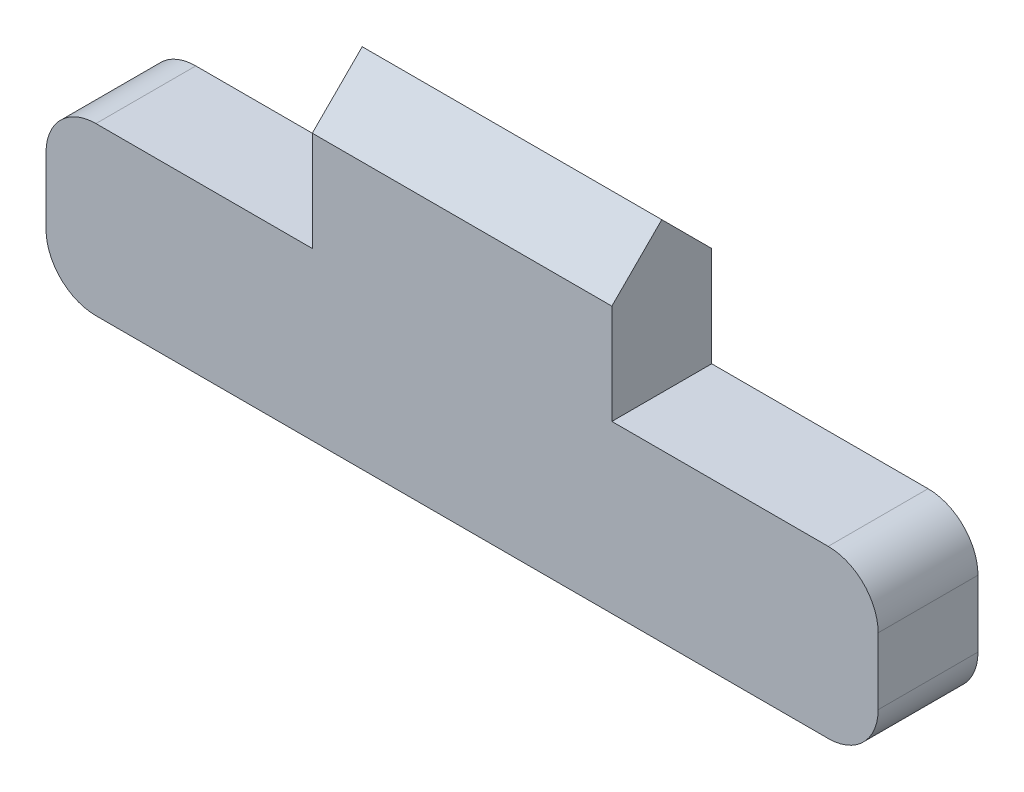
ISO-10303-21;
HEADER;
FILE_DESCRIPTION(('STEP AP214'),'2;1');
FILE_NAME('part.step','',(''),(''),'','','');
FILE_SCHEMA(('AUTOMOTIVE_DESIGN { 1 0 10303 214 1 1 1 1 }'));
ENDSEC;
DATA;
#1=APPLICATION_CONTEXT('core data for automotive mechanical design processes');
#2=APPLICATION_PROTOCOL_DEFINITION('international standard','automotive_design',2000,#1);
#3=PRODUCT_CONTEXT('',#1,'mechanical');
#4=PRODUCT('Part','Part','',(#3));
#5=PRODUCT_RELATED_PRODUCT_CATEGORY('part','',(#4));
#6=PRODUCT_DEFINITION_FORMATION('','',#4);
#7=PRODUCT_DEFINITION_CONTEXT('part definition',#1,'design');
#8=PRODUCT_DEFINITION('design','',#6,#7);
#9=PRODUCT_DEFINITION_SHAPE('','',#8);
#10=(LENGTH_UNIT() NAMED_UNIT(*) SI_UNIT(.MILLI.,.METRE.));
#11=(NAMED_UNIT(*) PLANE_ANGLE_UNIT() SI_UNIT($,.RADIAN.));
#12=(NAMED_UNIT(*) SI_UNIT($,.STERADIAN.) SOLID_ANGLE_UNIT());
#13=UNCERTAINTY_MEASURE_WITH_UNIT(LENGTH_MEASURE(1.E-05),#10,'distance_accuracy_value','');
#14=(GEOMETRIC_REPRESENTATION_CONTEXT(3) GLOBAL_UNCERTAINTY_ASSIGNED_CONTEXT((#13)) GLOBAL_UNIT_ASSIGNED_CONTEXT((#10,
#11,#12)) REPRESENTATION_CONTEXT('',''));
#15=CARTESIAN_POINT('',(0.,0.,0.));
#16=DIRECTION('',(0.,0.,1.));
#17=DIRECTION('',(1.,0.,0.));
#18=AXIS2_PLACEMENT_3D('',#15,#16,#17);
#19=CARTESIAN_POINT('',(-9.,10.,6.));
#20=DIRECTION('',(1.,0.,0.));
#21=DIRECTION('',(0.,1.,0.));
#22=AXIS2_PLACEMENT_3D('',#19,#20,#21);
#23=PLANE('',#22);
#24=DIRECTION('',(0.,-1.,0.));
#25=VECTOR('',#24,1.);
#26=CARTESIAN_POINT('',(-9.,10.,6.));
#27=LINE('',#26,#25);
#28=CARTESIAN_POINT('',(-9.,16.,6.));
#29=VERTEX_POINT('',#28);
#30=CARTESIAN_POINT('',(-9.,10.,6.));
#31=VERTEX_POINT('',#30);
#32=EDGE_CURVE('E133',#29,#31,#27,.T.);
#33=ORIENTED_EDGE('',*,*,#32,.F.);
#34=DIRECTION('',(0.,0.707106781186546,-0.707106781186549));
#35=VECTOR('',#34,1.);
#36=CARTESIAN_POINT('',(-9.,16.,6.));
#37=LINE('',#36,#35);
#38=CARTESIAN_POINT('',(-9.,19.,3.00000000000001));
#39=VERTEX_POINT('',#38);
#40=EDGE_CURVE('E201',#29,#39,#37,.T.);
#41=ORIENTED_EDGE('',*,*,#40,.T.);
#42=DIRECTION('',(0.,0.707106781186548,0.707106781186547));
#43=VECTOR('',#42,1.);
#44=CARTESIAN_POINT('',(-9.,19.,3.00000000000001));
#45=LINE('',#44,#43);
#46=CARTESIAN_POINT('',(-9.,16.,0.));
#47=VERTEX_POINT('',#46);
#48=EDGE_CURVE('E199',#39,#47,#45,.F.);
#49=ORIENTED_EDGE('',*,*,#48,.T.);
#50=DIRECTION('',(0.,-1.,0.));
#51=VECTOR('',#50,1.);
#52=CARTESIAN_POINT('',(-9.,10.,0.));
#53=LINE('',#52,#51);
#54=CARTESIAN_POINT('',(-9.,10.,0.));
#55=VERTEX_POINT('',#54);
#56=EDGE_CURVE('E154',#47,#55,#53,.T.);
#57=ORIENTED_EDGE('',*,*,#56,.T.);
#58=DIRECTION('',(0.,0.,-1.));
#59=VECTOR('',#58,1.);
#60=CARTESIAN_POINT('',(-9.,10.,6.));
#61=LINE('',#60,#59);
#62=EDGE_CURVE('E149',#31,#55,#61,.T.);
#63=ORIENTED_EDGE('',*,*,#62,.F.);
#64=EDGE_LOOP('',(#33,#41,#49,#57,#63));
#65=FACE_BOUND('',#64,.T.);
#66=ADVANCED_FACE('F35',(#65),#23,.F.);
#67=CARTESIAN_POINT('',(-25.,10.,6.));
#68=DIRECTION('',(0.,-1.,0.));
#69=DIRECTION('',(1.,0.,0.));
#70=AXIS2_PLACEMENT_3D('',#67,#68,#69);
#71=PLANE('',#70);
#72=DIRECTION('',(-1.,0.,0.));
#73=VECTOR('',#72,1.);
#74=CARTESIAN_POINT('',(-25.,10.,0.));
#75=LINE('',#74,#73);
#76=CARTESIAN_POINT('',(-22.,10.,0.));
#77=VERTEX_POINT('',#76);
#78=EDGE_CURVE('E216',#55,#77,#75,.T.);
#79=ORIENTED_EDGE('',*,*,#78,.T.);
#80=DIRECTION('',(0.,0.,-1.));
#81=VECTOR('',#80,1.);
#82=CARTESIAN_POINT('',(-22.,10.,6.));
#83=LINE('',#82,#81);
#84=CARTESIAN_POINT('',(-22.,10.,6.));
#85=VERTEX_POINT('',#84);
#86=EDGE_CURVE('E151',#77,#85,#83,.F.);
#87=ORIENTED_EDGE('',*,*,#86,.T.);
#88=DIRECTION('',(-1.,0.,0.));
#89=VECTOR('',#88,1.);
#90=CARTESIAN_POINT('',(-25.,10.,6.));
#91=LINE('',#90,#89);
#92=EDGE_CURVE('E137',#31,#85,#91,.T.);
#93=ORIENTED_EDGE('',*,*,#92,.F.);
#94=ORIENTED_EDGE('',*,*,#62,.T.);
#95=EDGE_LOOP('',(#79,#87,#93,#94));
#96=FACE_BOUND('',#95,.T.);
#97=ADVANCED_FACE('F148',(#96),#71,.F.);
#98=CARTESIAN_POINT('',(-25.,0.,6.));
#99=DIRECTION('',(1.,0.,0.));
#100=DIRECTION('',(0.,1.,0.));
#101=AXIS2_PLACEMENT_3D('',#98,#99,#100);
#102=PLANE('',#101);
#103=DIRECTION('',(0.,-1.,0.));
#104=VECTOR('',#103,1.);
#105=CARTESIAN_POINT('',(-25.,0.,0.));
#106=LINE('',#105,#104);
#107=CARTESIAN_POINT('',(-25.,7.,0.));
#108=VERTEX_POINT('',#107);
#109=CARTESIAN_POINT('',(-25.,3.,0.));
#110=VERTEX_POINT('',#109);
#111=EDGE_CURVE('E218',#108,#110,#106,.T.);
#112=ORIENTED_EDGE('',*,*,#111,.T.);
#113=DIRECTION('',(0.,0.,-1.));
#114=VECTOR('',#113,1.);
#115=CARTESIAN_POINT('',(-25.,3.,6.));
#116=LINE('',#115,#114);
#117=CARTESIAN_POINT('',(-25.,3.,6.));
#118=VERTEX_POINT('',#117);
#119=EDGE_CURVE('E179',#110,#118,#116,.F.);
#120=ORIENTED_EDGE('',*,*,#119,.T.);
#121=DIRECTION('',(0.,-1.,0.));
#122=VECTOR('',#121,1.);
#123=CARTESIAN_POINT('',(-25.,0.,6.));
#124=LINE('',#123,#122);
#125=CARTESIAN_POINT('',(-25.,7.,6.));
#126=VERTEX_POINT('',#125);
#127=EDGE_CURVE('E152',#126,#118,#124,.T.);
#128=ORIENTED_EDGE('',*,*,#127,.F.);
#129=DIRECTION('',(0.,0.,-1.));
#130=VECTOR('',#129,1.);
#131=CARTESIAN_POINT('',(-25.,7.,6.));
#132=LINE('',#131,#130);
#133=EDGE_CURVE('E176',#126,#108,#132,.T.);
#134=ORIENTED_EDGE('',*,*,#133,.T.);
#135=EDGE_LOOP('',(#112,#120,#128,#134));
#136=FACE_BOUND('',#135,.T.);
#137=ADVANCED_FACE('F285',(#136),#102,.F.);
#138=CARTESIAN_POINT('',(-25.,0.,6.));
#139=DIRECTION('',(0.,1.,0.));
#140=DIRECTION('',(-1.,0.,0.));
#141=AXIS2_PLACEMENT_3D('',#138,#139,#140);
#142=PLANE('',#141);
#143=DIRECTION('',(1.,0.,0.));
#144=VECTOR('',#143,1.);
#145=CARTESIAN_POINT('',(-25.,0.,6.));
#146=LINE('',#145,#144);
#147=CARTESIAN_POINT('',(-22.,0.,6.));
#148=VERTEX_POINT('',#147);
#149=CARTESIAN_POINT('',(22.,0.,6.));
#150=VERTEX_POINT('',#149);
#151=EDGE_CURVE('E249',#148,#150,#146,.T.);
#152=ORIENTED_EDGE('',*,*,#151,.F.);
#153=DIRECTION('',(0.,0.,-1.));
#154=VECTOR('',#153,1.);
#155=CARTESIAN_POINT('',(-22.,0.,6.));
#156=LINE('',#155,#154);
#157=CARTESIAN_POINT('',(-22.,0.,0.));
#158=VERTEX_POINT('',#157);
#159=EDGE_CURVE('E159',#148,#158,#156,.T.);
#160=ORIENTED_EDGE('',*,*,#159,.T.);
#161=DIRECTION('',(1.,0.,0.));
#162=VECTOR('',#161,1.);
#163=CARTESIAN_POINT('',(-25.,0.,0.));
#164=LINE('',#163,#162);
#165=CARTESIAN_POINT('',(22.,0.,0.));
#166=VERTEX_POINT('',#165);
#167=EDGE_CURVE('E224',#158,#166,#164,.T.);
#168=ORIENTED_EDGE('',*,*,#167,.T.);
#169=DIRECTION('',(0.,0.,-1.));
#170=VECTOR('',#169,1.);
#171=CARTESIAN_POINT('',(22.,0.,6.));
#172=LINE('',#171,#170);
#173=EDGE_CURVE('E156',#166,#150,#172,.F.);
#174=ORIENTED_EDGE('',*,*,#173,.T.);
#175=EDGE_LOOP('',(#152,#160,#168,#174));
#176=FACE_BOUND('',#175,.T.);
#177=ADVANCED_FACE('F265',(#176),#142,.F.);
#178=CARTESIAN_POINT('',(25.,0.,6.));
#179=DIRECTION('',(-1.,0.,0.));
#180=DIRECTION('',(0.,-1.,0.));
#181=AXIS2_PLACEMENT_3D('',#178,#179,#180);
#182=PLANE('',#181);
#183=DIRECTION('',(0.,1.,0.));
#184=VECTOR('',#183,1.);
#185=CARTESIAN_POINT('',(25.,0.,6.));
#186=LINE('',#185,#184);
#187=CARTESIAN_POINT('',(25.,3.,6.));
#188=VERTEX_POINT('',#187);
#189=CARTESIAN_POINT('',(25.,7.00000000000001,6.));
#190=VERTEX_POINT('',#189);
#191=EDGE_CURVE('E245',#188,#190,#186,.T.);
#192=ORIENTED_EDGE('',*,*,#191,.F.);
#193=DIRECTION('',(0.,0.,-1.));
#194=VECTOR('',#193,1.);
#195=CARTESIAN_POINT('',(25.,3.,6.));
#196=LINE('',#195,#194);
#197=CARTESIAN_POINT('',(25.,3.,0.));
#198=VERTEX_POINT('',#197);
#199=EDGE_CURVE('E192',#188,#198,#196,.T.);
#200=ORIENTED_EDGE('',*,*,#199,.T.);
#201=DIRECTION('',(0.,1.,0.));
#202=VECTOR('',#201,1.);
#203=CARTESIAN_POINT('',(25.,0.,0.));
#204=LINE('',#203,#202);
#205=CARTESIAN_POINT('',(25.,7.00000000000001,0.));
#206=VERTEX_POINT('',#205);
#207=EDGE_CURVE('E227',#198,#206,#204,.T.);
#208=ORIENTED_EDGE('',*,*,#207,.T.);
#209=DIRECTION('',(0.,0.,-1.));
#210=VECTOR('',#209,1.);
#211=CARTESIAN_POINT('',(25.,7.00000000000001,6.));
#212=LINE('',#211,#210);
#213=EDGE_CURVE('E190',#206,#190,#212,.F.);
#214=ORIENTED_EDGE('',*,*,#213,.T.);
#215=EDGE_LOOP('',(#192,#200,#208,#214));
#216=FACE_BOUND('',#215,.T.);
#217=ADVANCED_FACE('F244',(#216),#182,.F.);
#218=CARTESIAN_POINT('',(25.,10.,6.));
#219=DIRECTION('',(0.,-1.,0.));
#220=DIRECTION('',(1.,0.,0.));
#221=AXIS2_PLACEMENT_3D('',#218,#219,#220);
#222=PLANE('',#221);
#223=DIRECTION('',(-1.,0.,0.));
#224=VECTOR('',#223,1.);
#225=CARTESIAN_POINT('',(25.,10.,6.));
#226=LINE('',#225,#224);
#227=CARTESIAN_POINT('',(22.,10.,6.));
#228=VERTEX_POINT('',#227);
#229=CARTESIAN_POINT('',(9.,10.,6.));
#230=VERTEX_POINT('',#229);
#231=EDGE_CURVE('E210',#228,#230,#226,.T.);
#232=ORIENTED_EDGE('',*,*,#231,.F.);
#233=DIRECTION('',(0.,0.,-1.));
#234=VECTOR('',#233,1.);
#235=CARTESIAN_POINT('',(22.,10.,6.));
#236=LINE('',#235,#234);
#237=CARTESIAN_POINT('',(22.,10.,0.));
#238=VERTEX_POINT('',#237);
#239=EDGE_CURVE('E195',#228,#238,#236,.T.);
#240=ORIENTED_EDGE('',*,*,#239,.T.);
#241=DIRECTION('',(-1.,0.,0.));
#242=VECTOR('',#241,1.);
#243=CARTESIAN_POINT('',(25.,10.,0.));
#244=LINE('',#243,#242);
#245=CARTESIAN_POINT('',(9.,10.,0.));
#246=VERTEX_POINT('',#245);
#247=EDGE_CURVE('E230',#238,#246,#244,.T.);
#248=ORIENTED_EDGE('',*,*,#247,.T.);
#249=DIRECTION('',(0.,0.,-1.));
#250=VECTOR('',#249,1.);
#251=CARTESIAN_POINT('',(9.,10.,6.));
#252=LINE('',#251,#250);
#253=EDGE_CURVE('E157',#230,#246,#252,.T.);
#254=ORIENTED_EDGE('',*,*,#253,.F.);
#255=EDGE_LOOP('',(#232,#240,#248,#254));
#256=FACE_BOUND('',#255,.T.);
#257=ADVANCED_FACE('F235',(#256),#222,.F.);
#258=CARTESIAN_POINT('',(9.,10.,6.));
#259=DIRECTION('',(-1.,0.,0.));
#260=DIRECTION('',(0.,-1.,0.));
#261=AXIS2_PLACEMENT_3D('',#258,#259,#260);
#262=PLANE('',#261);
#263=DIRECTION('',(0.,-0.707106781186548,-0.707106781186547));
#264=VECTOR('',#263,1.);
#265=CARTESIAN_POINT('',(9.,19.,3.00000000000001));
#266=LINE('',#265,#264);
#267=CARTESIAN_POINT('',(9.,16.,0.));
#268=VERTEX_POINT('',#267);
#269=CARTESIAN_POINT('',(9.,19.,3.00000000000001));
#270=VERTEX_POINT('',#269);
#271=EDGE_CURVE('E52',#268,#270,#266,.F.);
#272=ORIENTED_EDGE('',*,*,#271,.T.);
#273=DIRECTION('',(0.,-0.707106781186546,0.707106781186549));
#274=VECTOR('',#273,1.);
#275=CARTESIAN_POINT('',(9.,16.,6.));
#276=LINE('',#275,#274);
#277=CARTESIAN_POINT('',(9.,16.,6.));
#278=VERTEX_POINT('',#277);
#279=EDGE_CURVE('E45',#270,#278,#276,.T.);
#280=ORIENTED_EDGE('',*,*,#279,.T.);
#281=DIRECTION('',(0.,1.,0.));
#282=VECTOR('',#281,1.);
#283=CARTESIAN_POINT('',(9.,10.,6.));
#284=LINE('',#283,#282);
#285=EDGE_CURVE('E162',#230,#278,#284,.T.);
#286=ORIENTED_EDGE('',*,*,#285,.F.);
#287=ORIENTED_EDGE('',*,*,#253,.T.);
#288=DIRECTION('',(0.,1.,0.));
#289=VECTOR('',#288,1.);
#290=CARTESIAN_POINT('',(9.,10.,0.));
#291=LINE('',#290,#289);
#292=EDGE_CURVE('E143',#246,#268,#291,.T.);
#293=ORIENTED_EDGE('',*,*,#292,.T.);
#294=EDGE_LOOP('',(#272,#280,#286,#287,#293));
#295=FACE_BOUND('',#294,.T.);
#296=ADVANCED_FACE('F206',(#295),#262,.F.);
#297=CARTESIAN_POINT('',(0.,0.,6.));
#298=DIRECTION('',(0.,0.,1.));
#299=DIRECTION('',(1.,0.,0.));
#300=AXIS2_PLACEMENT_3D('',#297,#298,#299);
#301=PLANE('',#300);
#302=ORIENTED_EDGE('',*,*,#285,.T.);
#303=DIRECTION('',(-1.,0.,0.));
#304=VECTOR('',#303,1.);
#305=CARTESIAN_POINT('',(-9.,16.,6.));
#306=LINE('',#305,#304);
#307=EDGE_CURVE('E140',#278,#29,#306,.T.);
#308=ORIENTED_EDGE('',*,*,#307,.T.);
#309=ORIENTED_EDGE('',*,*,#32,.T.);
#310=ORIENTED_EDGE('',*,*,#92,.T.);
#311=CARTESIAN_POINT('',(-22.,7.,6.));
#312=DIRECTION('',(0.,0.,1.));
#313=DIRECTION('',(1.,0.,0.));
#314=AXIS2_PLACEMENT_3D('',#311,#312,#313);
#315=CIRCLE('',#314,3.);
#316=EDGE_CURVE('E185',#85,#126,#315,.T.);
#317=ORIENTED_EDGE('',*,*,#316,.T.);
#318=ORIENTED_EDGE('',*,*,#127,.T.);
#319=CARTESIAN_POINT('',(-22.,3.,6.));
#320=DIRECTION('',(0.,0.,1.));
#321=DIRECTION('',(1.,0.,0.));
#322=AXIS2_PLACEMENT_3D('',#319,#320,#321);
#323=CIRCLE('',#322,3.);
#324=EDGE_CURVE('E187',#118,#148,#323,.T.);
#325=ORIENTED_EDGE('',*,*,#324,.T.);
#326=ORIENTED_EDGE('',*,*,#151,.T.);
#327=CARTESIAN_POINT('',(22.,3.00000000000001,6.));
#328=DIRECTION('',(0.,0.,1.));
#329=DIRECTION('',(1.,0.,0.));
#330=AXIS2_PLACEMENT_3D('',#327,#328,#329);
#331=CIRCLE('',#330,3.);
#332=EDGE_CURVE('E183',#150,#188,#331,.T.);
#333=ORIENTED_EDGE('',*,*,#332,.T.);
#334=ORIENTED_EDGE('',*,*,#191,.T.);
#335=CARTESIAN_POINT('',(22.,7.00000000000001,6.));
#336=DIRECTION('',(0.,0.,1.));
#337=DIRECTION('',(1.,0.,0.));
#338=AXIS2_PLACEMENT_3D('',#335,#336,#337);
#339=CIRCLE('',#338,3.);
#340=EDGE_CURVE('E181',#190,#228,#339,.T.);
#341=ORIENTED_EDGE('',*,*,#340,.T.);
#342=ORIENTED_EDGE('',*,*,#231,.T.);
#343=EDGE_LOOP('',(#302,#308,#309,#310,#317,#318,#325,#326,#333,#334,#341,#342));
#344=FACE_BOUND('',#343,.T.);
#345=ADVANCED_FACE('F136',(#344),#301,.T.);
#346=CARTESIAN_POINT('',(0.,0.,0.));
#347=DIRECTION('',(0.,0.,1.));
#348=DIRECTION('',(1.,0.,0.));
#349=AXIS2_PLACEMENT_3D('',#346,#347,#348);
#350=PLANE('',#349);
#351=ORIENTED_EDGE('',*,*,#56,.F.);
#352=DIRECTION('',(1.,0.,0.));
#353=VECTOR('',#352,1.);
#354=CARTESIAN_POINT('',(0.,16.,0.));
#355=LINE('',#354,#353);
#356=EDGE_CURVE('E11',#47,#268,#355,.T.);
#357=ORIENTED_EDGE('',*,*,#356,.T.);
#358=ORIENTED_EDGE('',*,*,#292,.F.);
#359=ORIENTED_EDGE('',*,*,#247,.F.);
#360=CARTESIAN_POINT('',(22.,7.00000000000001,0.));
#361=DIRECTION('',(0.,0.,1.));
#362=DIRECTION('',(1.,0.,0.));
#363=AXIS2_PLACEMENT_3D('',#360,#361,#362);
#364=CIRCLE('',#363,3.);
#365=EDGE_CURVE('E168',#238,#206,#364,.F.);
#366=ORIENTED_EDGE('',*,*,#365,.T.);
#367=ORIENTED_EDGE('',*,*,#207,.F.);
#368=CARTESIAN_POINT('',(22.,3.00000000000001,0.));
#369=DIRECTION('',(0.,0.,1.));
#370=DIRECTION('',(1.,0.,0.));
#371=AXIS2_PLACEMENT_3D('',#368,#369,#370);
#372=CIRCLE('',#371,3.);
#373=EDGE_CURVE('E170',#198,#166,#372,.F.);
#374=ORIENTED_EDGE('',*,*,#373,.T.);
#375=ORIENTED_EDGE('',*,*,#167,.F.);
#376=CARTESIAN_POINT('',(-22.,3.,0.));
#377=DIRECTION('',(0.,0.,1.));
#378=DIRECTION('',(1.,0.,0.));
#379=AXIS2_PLACEMENT_3D('',#376,#377,#378);
#380=CIRCLE('',#379,3.);
#381=EDGE_CURVE('E174',#158,#110,#380,.F.);
#382=ORIENTED_EDGE('',*,*,#381,.T.);
#383=ORIENTED_EDGE('',*,*,#111,.F.);
#384=CARTESIAN_POINT('',(-22.,7.,0.));
#385=DIRECTION('',(0.,0.,1.));
#386=DIRECTION('',(1.,0.,0.));
#387=AXIS2_PLACEMENT_3D('',#384,#385,#386);
#388=CIRCLE('',#387,3.);
#389=EDGE_CURVE('E172',#108,#77,#388,.F.);
#390=ORIENTED_EDGE('',*,*,#389,.T.);
#391=ORIENTED_EDGE('',*,*,#78,.F.);
#392=EDGE_LOOP('',(#351,#357,#358,#359,#366,#367,#374,#375,#382,#383,#390,#391));
#393=FACE_BOUND('',#392,.T.);
#394=ADVANCED_FACE('F232',(#393),#350,.F.);
#395=CARTESIAN_POINT('',(-22.,3.,6.));
#396=DIRECTION('',(0.,0.,-1.));
#397=DIRECTION('',(-1.,0.,0.));
#398=AXIS2_PLACEMENT_3D('',#395,#396,#397);
#399=CYLINDRICAL_SURFACE('',#398,3.);
#400=ORIENTED_EDGE('',*,*,#324,.F.);
#401=ORIENTED_EDGE('',*,*,#119,.F.);
#402=ORIENTED_EDGE('',*,*,#381,.F.);
#403=ORIENTED_EDGE('',*,*,#159,.F.);
#404=EDGE_LOOP('',(#400,#401,#402,#403));
#405=FACE_BOUND('',#404,.T.);
#406=ADVANCED_FACE('F262',(#405),#399,.T.);
#407=CARTESIAN_POINT('',(-22.,7.,6.));
#408=DIRECTION('',(0.,0.,-1.));
#409=DIRECTION('',(-1.,0.,0.));
#410=AXIS2_PLACEMENT_3D('',#407,#408,#409);
#411=CYLINDRICAL_SURFACE('',#410,3.);
#412=ORIENTED_EDGE('',*,*,#316,.F.);
#413=ORIENTED_EDGE('',*,*,#86,.F.);
#414=ORIENTED_EDGE('',*,*,#389,.F.);
#415=ORIENTED_EDGE('',*,*,#133,.F.);
#416=EDGE_LOOP('',(#412,#413,#414,#415));
#417=FACE_BOUND('',#416,.T.);
#418=ADVANCED_FACE('F271',(#417),#411,.T.);
#419=CARTESIAN_POINT('',(22.,3.00000000000001,6.));
#420=DIRECTION('',(0.,0.,-1.));
#421=DIRECTION('',(-1.,0.,0.));
#422=AXIS2_PLACEMENT_3D('',#419,#420,#421);
#423=CYLINDRICAL_SURFACE('',#422,3.);
#424=ORIENTED_EDGE('',*,*,#332,.F.);
#425=ORIENTED_EDGE('',*,*,#173,.F.);
#426=ORIENTED_EDGE('',*,*,#373,.F.);
#427=ORIENTED_EDGE('',*,*,#199,.F.);
#428=EDGE_LOOP('',(#424,#425,#426,#427));
#429=FACE_BOUND('',#428,.T.);
#430=ADVANCED_FACE('F269',(#429),#423,.T.);
#431=CARTESIAN_POINT('',(22.,7.00000000000001,6.));
#432=DIRECTION('',(0.,0.,-1.));
#433=DIRECTION('',(-1.,0.,0.));
#434=AXIS2_PLACEMENT_3D('',#431,#432,#433);
#435=CYLINDRICAL_SURFACE('',#434,3.);
#436=ORIENTED_EDGE('',*,*,#340,.F.);
#437=ORIENTED_EDGE('',*,*,#213,.F.);
#438=ORIENTED_EDGE('',*,*,#365,.F.);
#439=ORIENTED_EDGE('',*,*,#239,.F.);
#440=EDGE_LOOP('',(#436,#437,#438,#439));
#441=FACE_BOUND('',#440,.T.);
#442=ADVANCED_FACE('F239',(#441),#435,.T.);
#443=CARTESIAN_POINT('',(9.,19.,3.00000000000001));
#444=DIRECTION('',(0.,-0.707106781186547,0.707106781186548));
#445=DIRECTION('',(-1.,0.,0.));
#446=AXIS2_PLACEMENT_3D('',#443,#444,#445);
#447=PLANE('',#446);
#448=DIRECTION('',(-1.,0.,0.));
#449=VECTOR('',#448,1.);
#450=CARTESIAN_POINT('',(9.,19.,3.00000000000001));
#451=LINE('',#450,#449);
#452=EDGE_CURVE('E40',#270,#39,#451,.T.);
#453=ORIENTED_EDGE('',*,*,#452,.F.);
#454=ORIENTED_EDGE('',*,*,#271,.F.);
#455=ORIENTED_EDGE('',*,*,#356,.F.);
#456=ORIENTED_EDGE('',*,*,#48,.F.);
#457=EDGE_LOOP('',(#453,#454,#455,#456));
#458=FACE_BOUND('',#457,.T.);
#459=ADVANCED_FACE('F38',(#458),#447,.F.);
#460=CARTESIAN_POINT('',(0.,16.,6.));
#461=DIRECTION('',(0.,0.707106781186549,0.707106781186546));
#462=DIRECTION('',(1.,0.,0.));
#463=AXIS2_PLACEMENT_3D('',#460,#461,#462);
#464=PLANE('',#463);
#465=ORIENTED_EDGE('',*,*,#279,.F.);
#466=ORIENTED_EDGE('',*,*,#452,.T.);
#467=ORIENTED_EDGE('',*,*,#40,.F.);
#468=ORIENTED_EDGE('',*,*,#307,.F.);
#469=EDGE_LOOP('',(#465,#466,#467,#468));
#470=FACE_BOUND('',#469,.T.);
#471=ADVANCED_FACE('F213',(#470),#464,.T.);
#472=CLOSED_SHELL('',(#66,#97,#137,#177,#217,#257,#296,#345,#394,#406,#418,#430,#442,#459,#471));
#473=MANIFOLD_SOLID_BREP('B2',#472);
#474=ADVANCED_BREP_SHAPE_REPRESENTATION('',(#18,#473),#14);
#475=SHAPE_DEFINITION_REPRESENTATION(#9,#474);
ENDSEC;
END-ISO-10303-21;
